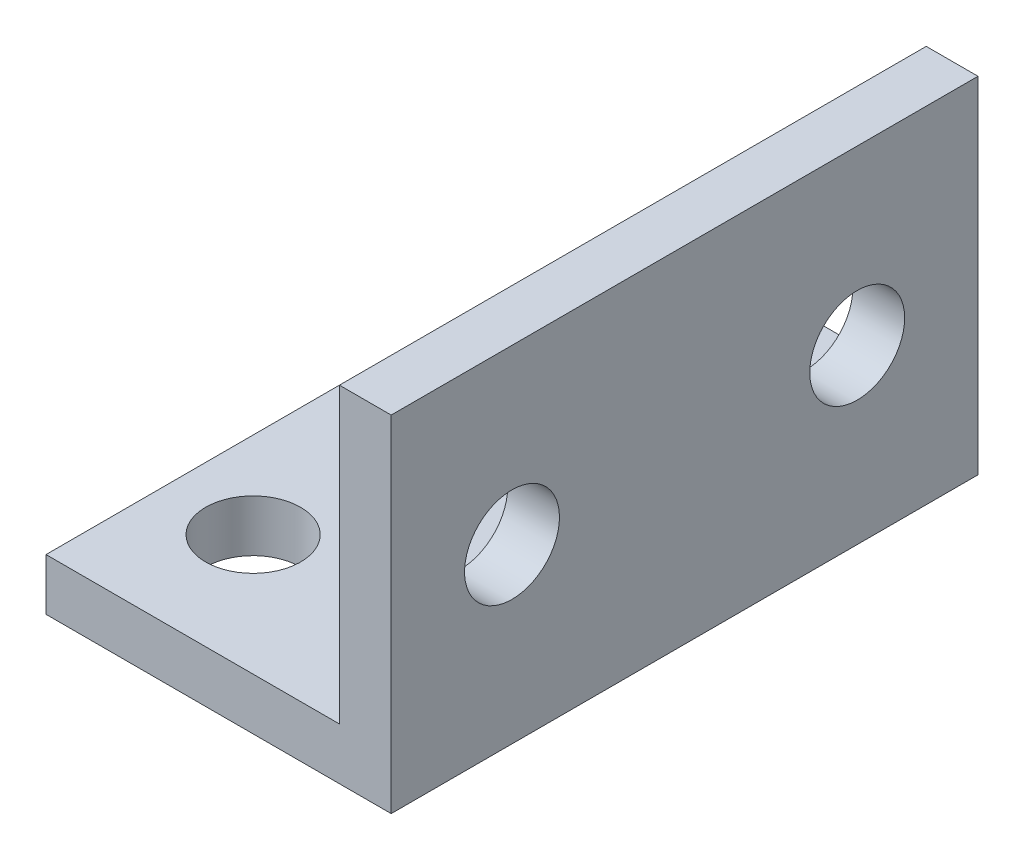
ISO-10303-21;
HEADER;
FILE_DESCRIPTION(('STEP AP214'),'2;1');
FILE_NAME('part.step','',(''),(''),'','','');
FILE_SCHEMA(('AUTOMOTIVE_DESIGN { 1 0 10303 214 1 1 1 1 }'));
ENDSEC;
DATA;
#1=APPLICATION_CONTEXT('core data for automotive mechanical design processes');
#2=APPLICATION_PROTOCOL_DEFINITION('international standard','automotive_design',2000,#1);
#3=PRODUCT_CONTEXT('',#1,'mechanical');
#4=PRODUCT('Part','Part','',(#3));
#5=PRODUCT_RELATED_PRODUCT_CATEGORY('part','',(#4));
#6=PRODUCT_DEFINITION_FORMATION('','',#4);
#7=PRODUCT_DEFINITION_CONTEXT('part definition',#1,'design');
#8=PRODUCT_DEFINITION('design','',#6,#7);
#9=PRODUCT_DEFINITION_SHAPE('','',#8);
#10=(LENGTH_UNIT() NAMED_UNIT(*) SI_UNIT(.MILLI.,.METRE.));
#11=(NAMED_UNIT(*) PLANE_ANGLE_UNIT() SI_UNIT($,.RADIAN.));
#12=(NAMED_UNIT(*) SI_UNIT($,.STERADIAN.) SOLID_ANGLE_UNIT());
#13=UNCERTAINTY_MEASURE_WITH_UNIT(LENGTH_MEASURE(1.E-05),#10,'distance_accuracy_value','');
#14=(GEOMETRIC_REPRESENTATION_CONTEXT(3) GLOBAL_UNCERTAINTY_ASSIGNED_CONTEXT((#13)) GLOBAL_UNIT_ASSIGNED_CONTEXT((#10,
#11,#12)) REPRESENTATION_CONTEXT('',''));
#15=CARTESIAN_POINT('',(0.,0.,0.));
#16=DIRECTION('',(0.,0.,1.));
#17=DIRECTION('',(1.,0.,0.));
#18=AXIS2_PLACEMENT_3D('',#15,#16,#17);
#19=CARTESIAN_POINT('',(0.,0.,34.));
#20=DIRECTION('',(1.,0.,0.));
#21=DIRECTION('',(0.,0.,-1.));
#22=AXIS2_PLACEMENT_3D('',#19,#20,#21);
#23=PLANE('',#22);
#24=DIRECTION('',(0.,-1.,0.));
#25=VECTOR('',#24,1.);
#26=CARTESIAN_POINT('',(0.,0.,0.));
#27=LINE('',#26,#25);
#28=CARTESIAN_POINT('',(0.,0.,0.));
#29=VERTEX_POINT('',#28);
#30=CARTESIAN_POINT('',(0.,-3.,0.));
#31=VERTEX_POINT('',#30);
#32=EDGE_CURVE('E136',#29,#31,#27,.T.);
#33=ORIENTED_EDGE('',*,*,#32,.T.);
#34=DIRECTION('',(0.,0.,-1.));
#35=VECTOR('',#34,1.);
#36=CARTESIAN_POINT('',(0.,-3.,34.));
#37=LINE('',#36,#35);
#38=CARTESIAN_POINT('',(0.,-3.,34.));
#39=VERTEX_POINT('',#38);
#40=EDGE_CURVE('E11',#39,#31,#37,.T.);
#41=ORIENTED_EDGE('',*,*,#40,.F.);
#42=DIRECTION('',(0.,-1.,0.));
#43=VECTOR('',#42,1.);
#44=CARTESIAN_POINT('',(0.,0.,34.));
#45=LINE('',#44,#43);
#46=CARTESIAN_POINT('',(0.,0.,34.));
#47=VERTEX_POINT('',#46);
#48=EDGE_CURVE('E153',#47,#39,#45,.T.);
#49=ORIENTED_EDGE('',*,*,#48,.F.);
#50=DIRECTION('',(0.,0.,-1.));
#51=VECTOR('',#50,1.);
#52=CARTESIAN_POINT('',(0.,0.,34.));
#53=LINE('',#52,#51);
#54=EDGE_CURVE('E132',#47,#29,#53,.T.);
#55=ORIENTED_EDGE('',*,*,#54,.T.);
#56=EDGE_LOOP('',(#33,#41,#49,#55));
#57=FACE_BOUND('',#56,.T.);
#58=ADVANCED_FACE('F45',(#57),#23,.F.);
#59=CARTESIAN_POINT('',(0.,-3.,34.));
#60=DIRECTION('',(0.,1.,0.));
#61=DIRECTION('',(0.,0.,1.));
#62=AXIS2_PLACEMENT_3D('',#59,#60,#61);
#63=PLANE('',#62);
#64=CARTESIAN_POINT('',(5.,-3.,7.));
#65=DIRECTION('',(0.,-1.,0.));
#66=DIRECTION('',(0.,0.,-1.));
#67=AXIS2_PLACEMENT_3D('',#64,#65,#66);
#68=CIRCLE('',#67,2.75);
#69=CARTESIAN_POINT('',(5.,-3.,4.25));
#70=VERTEX_POINT('',#69);
#71=EDGE_CURVE('E173',#70,#70,#68,.T.);
#72=ORIENTED_EDGE('',*,*,#71,.F.);
#73=EDGE_LOOP('',(#72));
#74=FACE_BOUND('',#73,.T.);
#75=CARTESIAN_POINT('',(5.,-3.,27.));
#76=DIRECTION('',(0.,-1.,0.));
#77=DIRECTION('',(0.,0.,-1.));
#78=AXIS2_PLACEMENT_3D('',#75,#76,#77);
#79=CIRCLE('',#78,2.75);
#80=CARTESIAN_POINT('',(5.,-3.,24.25));
#81=VERTEX_POINT('',#80);
#82=EDGE_CURVE('E181',#81,#81,#79,.T.);
#83=ORIENTED_EDGE('',*,*,#82,.F.);
#84=EDGE_LOOP('',(#83));
#85=FACE_BOUND('',#84,.T.);
#86=DIRECTION('',(1.,0.,0.));
#87=VECTOR('',#86,1.);
#88=CARTESIAN_POINT('',(0.,-3.,0.));
#89=LINE('',#88,#87);
#90=CARTESIAN_POINT('',(20.,-3.,0.));
#91=VERTEX_POINT('',#90);
#92=EDGE_CURVE('E140',#31,#91,#89,.T.);
#93=ORIENTED_EDGE('',*,*,#92,.T.);
#94=DIRECTION('',(0.,0.,-1.));
#95=VECTOR('',#94,1.);
#96=CARTESIAN_POINT('',(20.,-3.,34.));
#97=LINE('',#96,#95);
#98=CARTESIAN_POINT('',(20.,-3.,34.));
#99=VERTEX_POINT('',#98);
#100=EDGE_CURVE('E55',#99,#91,#97,.T.);
#101=ORIENTED_EDGE('',*,*,#100,.F.);
#102=DIRECTION('',(1.,0.,0.));
#103=VECTOR('',#102,1.);
#104=CARTESIAN_POINT('',(0.,-3.,34.));
#105=LINE('',#104,#103);
#106=EDGE_CURVE('E101',#39,#99,#105,.T.);
#107=ORIENTED_EDGE('',*,*,#106,.F.);
#108=ORIENTED_EDGE('',*,*,#40,.T.);
#109=EDGE_LOOP('',(#93,#101,#107,#108));
#110=FACE_BOUND('',#109,.T.);
#111=ADVANCED_FACE('F201',(#74,#85,#110),#63,.F.);
#112=CARTESIAN_POINT('',(20.,-3.,34.));
#113=DIRECTION('',(-1.,0.,0.));
#114=DIRECTION('',(0.,0.,1.));
#115=AXIS2_PLACEMENT_3D('',#112,#113,#114);
#116=PLANE('',#115);
#117=CARTESIAN_POINT('',(20.,7.,27.));
#118=DIRECTION('',(1.,0.,0.));
#119=DIRECTION('',(0.,0.,-1.));
#120=AXIS2_PLACEMENT_3D('',#117,#118,#119);
#121=CIRCLE('',#120,2.75);
#122=CARTESIAN_POINT('',(20.,7.,24.25));
#123=VERTEX_POINT('',#122);
#124=EDGE_CURVE('E167',#123,#123,#121,.T.);
#125=ORIENTED_EDGE('',*,*,#124,.F.);
#126=EDGE_LOOP('',(#125));
#127=FACE_BOUND('',#126,.T.);
#128=CARTESIAN_POINT('',(20.,7.,7.));
#129=DIRECTION('',(1.,0.,0.));
#130=DIRECTION('',(0.,0.,-1.));
#131=AXIS2_PLACEMENT_3D('',#128,#129,#130);
#132=CIRCLE('',#131,2.75);
#133=CARTESIAN_POINT('',(20.,7.,4.25));
#134=VERTEX_POINT('',#133);
#135=EDGE_CURVE('E179',#134,#134,#132,.T.);
#136=ORIENTED_EDGE('',*,*,#135,.F.);
#137=EDGE_LOOP('',(#136));
#138=FACE_BOUND('',#137,.T.);
#139=DIRECTION('',(0.,1.,0.));
#140=VECTOR('',#139,1.);
#141=CARTESIAN_POINT('',(20.,-3.,0.));
#142=LINE('',#141,#140);
#143=CARTESIAN_POINT('',(20.,17.,0.));
#144=VERTEX_POINT('',#143);
#145=EDGE_CURVE('E144',#91,#144,#142,.T.);
#146=ORIENTED_EDGE('',*,*,#145,.T.);
#147=DIRECTION('',(0.,0.,-1.));
#148=VECTOR('',#147,1.);
#149=CARTESIAN_POINT('',(20.,17.,34.));
#150=LINE('',#149,#148);
#151=CARTESIAN_POINT('',(20.,17.,34.));
#152=VERTEX_POINT('',#151);
#153=EDGE_CURVE('E125',#152,#144,#150,.T.);
#154=ORIENTED_EDGE('',*,*,#153,.F.);
#155=DIRECTION('',(0.,1.,0.));
#156=VECTOR('',#155,1.);
#157=CARTESIAN_POINT('',(20.,-3.,34.));
#158=LINE('',#157,#156);
#159=EDGE_CURVE('E114',#99,#152,#158,.T.);
#160=ORIENTED_EDGE('',*,*,#159,.F.);
#161=ORIENTED_EDGE('',*,*,#100,.T.);
#162=EDGE_LOOP('',(#146,#154,#160,#161));
#163=FACE_BOUND('',#162,.T.);
#164=ADVANCED_FACE('F204',(#127,#138,#163),#116,.F.);
#165=CARTESIAN_POINT('',(17.,17.,34.));
#166=DIRECTION('',(0.,-1.,0.));
#167=DIRECTION('',(0.,0.,-1.));
#168=AXIS2_PLACEMENT_3D('',#165,#166,#167);
#169=PLANE('',#168);
#170=DIRECTION('',(-1.,0.,0.));
#171=VECTOR('',#170,1.);
#172=CARTESIAN_POINT('',(17.,17.,0.));
#173=LINE('',#172,#171);
#174=CARTESIAN_POINT('',(17.,17.,0.));
#175=VERTEX_POINT('',#174);
#176=EDGE_CURVE('E123',#144,#175,#173,.T.);
#177=ORIENTED_EDGE('',*,*,#176,.T.);
#178=DIRECTION('',(0.,0.,-1.));
#179=VECTOR('',#178,1.);
#180=CARTESIAN_POINT('',(17.,17.,34.));
#181=LINE('',#180,#179);
#182=CARTESIAN_POINT('',(17.,17.,34.));
#183=VERTEX_POINT('',#182);
#184=EDGE_CURVE('E120',#183,#175,#181,.T.);
#185=ORIENTED_EDGE('',*,*,#184,.F.);
#186=DIRECTION('',(-1.,0.,0.));
#187=VECTOR('',#186,1.);
#188=CARTESIAN_POINT('',(17.,17.,34.));
#189=LINE('',#188,#187);
#190=EDGE_CURVE('E108',#152,#183,#189,.T.);
#191=ORIENTED_EDGE('',*,*,#190,.F.);
#192=ORIENTED_EDGE('',*,*,#153,.T.);
#193=EDGE_LOOP('',(#177,#185,#191,#192));
#194=FACE_BOUND('',#193,.T.);
#195=ADVANCED_FACE('F121',(#194),#169,.F.);
#196=CARTESIAN_POINT('',(17.,0.,34.));
#197=DIRECTION('',(1.,0.,0.));
#198=DIRECTION('',(0.,0.,-1.));
#199=AXIS2_PLACEMENT_3D('',#196,#197,#198);
#200=PLANE('',#199);
#201=CARTESIAN_POINT('',(17.,7.,27.));
#202=DIRECTION('',(1.,0.,0.));
#203=DIRECTION('',(0.,0.,-1.));
#204=AXIS2_PLACEMENT_3D('',#201,#202,#203);
#205=CIRCLE('',#204,2.75);
#206=CARTESIAN_POINT('',(17.,7.,24.25));
#207=VERTEX_POINT('',#206);
#208=EDGE_CURVE('E141',#207,#207,#205,.T.);
#209=ORIENTED_EDGE('',*,*,#208,.T.);
#210=EDGE_LOOP('',(#209));
#211=FACE_BOUND('',#210,.T.);
#212=CARTESIAN_POINT('',(17.,7.,7.));
#213=DIRECTION('',(1.,0.,0.));
#214=DIRECTION('',(0.,0.,-1.));
#215=AXIS2_PLACEMENT_3D('',#212,#213,#214);
#216=CIRCLE('',#215,2.75);
#217=CARTESIAN_POINT('',(17.,7.,4.25));
#218=VERTEX_POINT('',#217);
#219=EDGE_CURVE('E163',#218,#218,#216,.T.);
#220=ORIENTED_EDGE('',*,*,#219,.T.);
#221=EDGE_LOOP('',(#220));
#222=FACE_BOUND('',#221,.T.);
#223=DIRECTION('',(0.,-1.,0.));
#224=VECTOR('',#223,1.);
#225=CARTESIAN_POINT('',(17.,0.,0.));
#226=LINE('',#225,#224);
#227=CARTESIAN_POINT('',(17.,0.,0.));
#228=VERTEX_POINT('',#227);
#229=EDGE_CURVE('E87',#175,#228,#226,.T.);
#230=ORIENTED_EDGE('',*,*,#229,.T.);
#231=DIRECTION('',(0.,0.,-1.));
#232=VECTOR('',#231,1.);
#233=CARTESIAN_POINT('',(17.,0.,34.));
#234=LINE('',#233,#232);
#235=CARTESIAN_POINT('',(17.,0.,34.));
#236=VERTEX_POINT('',#235);
#237=EDGE_CURVE('E126',#236,#228,#234,.T.);
#238=ORIENTED_EDGE('',*,*,#237,.F.);
#239=DIRECTION('',(0.,-1.,0.));
#240=VECTOR('',#239,1.);
#241=CARTESIAN_POINT('',(17.,0.,34.));
#242=LINE('',#241,#240);
#243=EDGE_CURVE('E112',#183,#236,#242,.T.);
#244=ORIENTED_EDGE('',*,*,#243,.F.);
#245=ORIENTED_EDGE('',*,*,#184,.T.);
#246=EDGE_LOOP('',(#230,#238,#244,#245));
#247=FACE_BOUND('',#246,.T.);
#248=ADVANCED_FACE('F128',(#211,#222,#247),#200,.F.);
#249=CARTESIAN_POINT('',(0.,0.,34.));
#250=DIRECTION('',(0.,-1.,0.));
#251=DIRECTION('',(0.,0.,-1.));
#252=AXIS2_PLACEMENT_3D('',#249,#250,#251);
#253=PLANE('',#252);
#254=CARTESIAN_POINT('',(5.,0.,7.));
#255=DIRECTION('',(0.,-1.,0.));
#256=DIRECTION('',(0.,0.,-1.));
#257=AXIS2_PLACEMENT_3D('',#254,#255,#256);
#258=CIRCLE('',#257,2.75);
#259=CARTESIAN_POINT('',(5.,0.,4.25));
#260=VERTEX_POINT('',#259);
#261=EDGE_CURVE('E48',#260,#260,#258,.T.);
#262=ORIENTED_EDGE('',*,*,#261,.T.);
#263=EDGE_LOOP('',(#262));
#264=FACE_BOUND('',#263,.T.);
#265=CARTESIAN_POINT('',(5.,0.,27.));
#266=DIRECTION('',(0.,-1.,0.));
#267=DIRECTION('',(0.,0.,-1.));
#268=AXIS2_PLACEMENT_3D('',#265,#266,#267);
#269=CIRCLE('',#268,2.75);
#270=CARTESIAN_POINT('',(5.,0.,24.25));
#271=VERTEX_POINT('',#270);
#272=EDGE_CURVE('E170',#271,#271,#269,.T.);
#273=ORIENTED_EDGE('',*,*,#272,.T.);
#274=EDGE_LOOP('',(#273));
#275=FACE_BOUND('',#274,.T.);
#276=DIRECTION('',(-1.,0.,0.));
#277=VECTOR('',#276,1.);
#278=CARTESIAN_POINT('',(0.,0.,0.));
#279=LINE('',#278,#277);
#280=EDGE_CURVE('E93',#228,#29,#279,.T.);
#281=ORIENTED_EDGE('',*,*,#280,.T.);
#282=ORIENTED_EDGE('',*,*,#54,.F.);
#283=DIRECTION('',(-1.,0.,0.));
#284=VECTOR('',#283,1.);
#285=CARTESIAN_POINT('',(0.,0.,34.));
#286=LINE('',#285,#284);
#287=EDGE_CURVE('E64',#236,#47,#286,.T.);
#288=ORIENTED_EDGE('',*,*,#287,.F.);
#289=ORIENTED_EDGE('',*,*,#237,.T.);
#290=EDGE_LOOP('',(#281,#282,#288,#289));
#291=FACE_BOUND('',#290,.T.);
#292=ADVANCED_FACE('F209',(#264,#275,#291),#253,.F.);
#293=CARTESIAN_POINT('',(0.,0.,34.));
#294=DIRECTION('',(0.,0.,1.));
#295=DIRECTION('',(1.,0.,0.));
#296=AXIS2_PLACEMENT_3D('',#293,#294,#295);
#297=PLANE('',#296);
#298=ORIENTED_EDGE('',*,*,#48,.T.);
#299=ORIENTED_EDGE('',*,*,#106,.T.);
#300=ORIENTED_EDGE('',*,*,#159,.T.);
#301=ORIENTED_EDGE('',*,*,#190,.T.);
#302=ORIENTED_EDGE('',*,*,#243,.T.);
#303=ORIENTED_EDGE('',*,*,#287,.T.);
#304=EDGE_LOOP('',(#298,#299,#300,#301,#302,#303));
#305=FACE_BOUND('',#304,.T.);
#306=ADVANCED_FACE('F110',(#305),#297,.T.);
#307=CARTESIAN_POINT('',(0.,0.,0.));
#308=DIRECTION('',(0.,0.,1.));
#309=DIRECTION('',(1.,0.,0.));
#310=AXIS2_PLACEMENT_3D('',#307,#308,#309);
#311=PLANE('',#310);
#312=ORIENTED_EDGE('',*,*,#32,.F.);
#313=ORIENTED_EDGE('',*,*,#280,.F.);
#314=ORIENTED_EDGE('',*,*,#229,.F.);
#315=ORIENTED_EDGE('',*,*,#176,.F.);
#316=ORIENTED_EDGE('',*,*,#145,.F.);
#317=ORIENTED_EDGE('',*,*,#92,.F.);
#318=EDGE_LOOP('',(#312,#313,#314,#315,#316,#317));
#319=FACE_BOUND('',#318,.T.);
#320=ADVANCED_FACE('F207',(#319),#311,.F.);
#321=CARTESIAN_POINT('',(0.,7.,7.));
#322=DIRECTION('',(1.,0.,0.));
#323=DIRECTION('',(0.,0.,-1.));
#324=AXIS2_PLACEMENT_3D('',#321,#322,#323);
#325=CYLINDRICAL_SURFACE('',#324,2.75);
#326=ORIENTED_EDGE('',*,*,#135,.T.);
#327=EDGE_LOOP('',(#326));
#328=FACE_BOUND('',#327,.T.);
#329=ORIENTED_EDGE('',*,*,#219,.F.);
#330=EDGE_LOOP('',(#329));
#331=FACE_BOUND('',#330,.T.);
#332=ADVANCED_FACE('F251',(#328,#331),#325,.F.);
#333=CARTESIAN_POINT('',(0.,7.,27.));
#334=DIRECTION('',(1.,0.,0.));
#335=DIRECTION('',(0.,0.,-1.));
#336=AXIS2_PLACEMENT_3D('',#333,#334,#335);
#337=CYLINDRICAL_SURFACE('',#336,2.75);
#338=ORIENTED_EDGE('',*,*,#124,.T.);
#339=EDGE_LOOP('',(#338));
#340=FACE_BOUND('',#339,.T.);
#341=ORIENTED_EDGE('',*,*,#208,.F.);
#342=EDGE_LOOP('',(#341));
#343=FACE_BOUND('',#342,.T.);
#344=ADVANCED_FACE('F266',(#340,#343),#337,.F.);
#345=CARTESIAN_POINT('',(5.,17.,27.));
#346=DIRECTION('',(0.,-1.,0.));
#347=DIRECTION('',(0.,0.,-1.));
#348=AXIS2_PLACEMENT_3D('',#345,#346,#347);
#349=CYLINDRICAL_SURFACE('',#348,2.75);
#350=ORIENTED_EDGE('',*,*,#82,.T.);
#351=EDGE_LOOP('',(#350));
#352=FACE_BOUND('',#351,.T.);
#353=ORIENTED_EDGE('',*,*,#272,.F.);
#354=EDGE_LOOP('',(#353));
#355=FACE_BOUND('',#354,.T.);
#356=ADVANCED_FACE('F274',(#352,#355),#349,.F.);
#357=CARTESIAN_POINT('',(5.,17.,7.));
#358=DIRECTION('',(0.,-1.,0.));
#359=DIRECTION('',(0.,0.,-1.));
#360=AXIS2_PLACEMENT_3D('',#357,#358,#359);
#361=CYLINDRICAL_SURFACE('',#360,2.75);
#362=ORIENTED_EDGE('',*,*,#71,.T.);
#363=EDGE_LOOP('',(#362));
#364=FACE_BOUND('',#363,.T.);
#365=ORIENTED_EDGE('',*,*,#261,.F.);
#366=EDGE_LOOP('',(#365));
#367=FACE_BOUND('',#366,.T.);
#368=ADVANCED_FACE('F286',(#364,#367),#361,.F.);
#369=CLOSED_SHELL('',(#58,#111,#164,#195,#248,#292,#306,#320,#332,#344,#356,#368));
#370=MANIFOLD_SOLID_BREP('B2',#369);
#371=ADVANCED_BREP_SHAPE_REPRESENTATION('',(#18,#370),#14);
#372=SHAPE_DEFINITION_REPRESENTATION(#9,#371);
ENDSEC;
END-ISO-10303-21;
